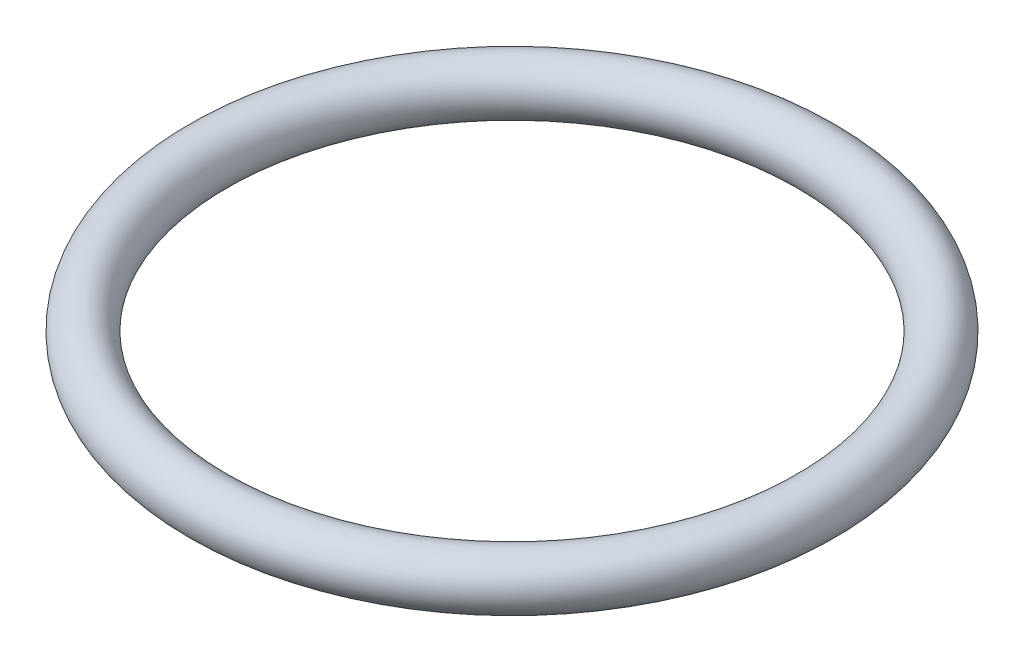
ISO-10303-21;
HEADER;
FILE_DESCRIPTION(('STEP AP214'),'2;1');
FILE_NAME('part.step','',(''),(''),'','','');
FILE_SCHEMA(('AUTOMOTIVE_DESIGN { 1 0 10303 214 1 1 1 1 }'));
ENDSEC;
DATA;
#1=APPLICATION_CONTEXT('core data for automotive mechanical design processes');
#2=APPLICATION_PROTOCOL_DEFINITION('international standard','automotive_design',2000,#1);
#3=PRODUCT_CONTEXT('',#1,'mechanical');
#4=PRODUCT('Part','Part','',(#3));
#5=PRODUCT_RELATED_PRODUCT_CATEGORY('part','',(#4));
#6=PRODUCT_DEFINITION_FORMATION('','',#4);
#7=PRODUCT_DEFINITION_CONTEXT('part definition',#1,'design');
#8=PRODUCT_DEFINITION('design','',#6,#7);
#9=PRODUCT_DEFINITION_SHAPE('','',#8);
#10=(LENGTH_UNIT() NAMED_UNIT(*) SI_UNIT(.MILLI.,.METRE.));
#11=(NAMED_UNIT(*) PLANE_ANGLE_UNIT() SI_UNIT($,.RADIAN.));
#12=(NAMED_UNIT(*) SI_UNIT($,.STERADIAN.) SOLID_ANGLE_UNIT());
#13=UNCERTAINTY_MEASURE_WITH_UNIT(LENGTH_MEASURE(1.E-05),#10,'distance_accuracy_value','');
#14=(GEOMETRIC_REPRESENTATION_CONTEXT(3) GLOBAL_UNCERTAINTY_ASSIGNED_CONTEXT((#13)) GLOBAL_UNIT_ASSIGNED_CONTEXT((#10,
#11,#12)) REPRESENTATION_CONTEXT('',''));
#15=CARTESIAN_POINT('',(0.,0.,0.));
#16=DIRECTION('',(0.,0.,1.));
#17=DIRECTION('',(1.,0.,0.));
#18=AXIS2_PLACEMENT_3D('',#15,#16,#17);
#19=CARTESIAN_POINT('',(0.,0.,0.));
#20=DIRECTION('',(0.,-1.,0.));
#21=DIRECTION('',(0.,0.,-1.));
#22=AXIS2_PLACEMENT_3D('',#19,#20,#21);
#23=TOROIDAL_SURFACE('',#22,29.,2.5);
#24=CARTESIAN_POINT('',(0.,0.,-31.5));
#25=VERTEX_POINT('',#24);
#26=VERTEX_LOOP('',#25);
#27=FACE_BOUND('',#26,.T.);
#28=ADVANCED_FACE('F29',(#27),#23,.T.);
#29=CLOSED_SHELL('',(#28));
#30=MANIFOLD_SOLID_BREP('B2',#29);
#31=ADVANCED_BREP_SHAPE_REPRESENTATION('',(#18,#30),#14);
#32=SHAPE_DEFINITION_REPRESENTATION(#9,#31);
ENDSEC;
END-ISO-10303-21;
